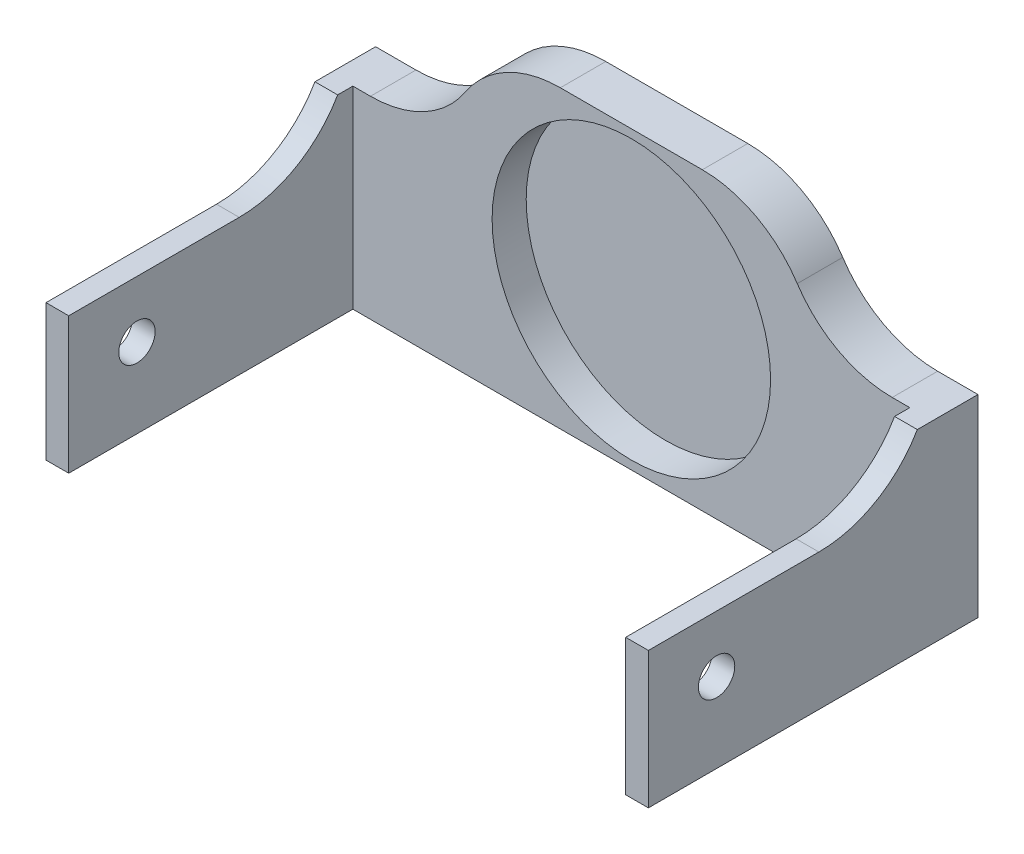
ISO-10303-21;
HEADER;
FILE_DESCRIPTION(('STEP AP214'),'2;1');
FILE_NAME('part.step','',(''),(''),'','','');
FILE_SCHEMA(('AUTOMOTIVE_DESIGN { 1 0 10303 214 1 1 1 1 }'));
ENDSEC;
DATA;
#1=APPLICATION_CONTEXT('core data for automotive mechanical design processes');
#2=APPLICATION_PROTOCOL_DEFINITION('international standard','automotive_design',2000,#1);
#3=PRODUCT_CONTEXT('',#1,'mechanical');
#4=PRODUCT('Part','Part','',(#3));
#5=PRODUCT_RELATED_PRODUCT_CATEGORY('part','',(#4));
#6=PRODUCT_DEFINITION_FORMATION('','',#4);
#7=PRODUCT_DEFINITION_CONTEXT('part definition',#1,'design');
#8=PRODUCT_DEFINITION('design','',#6,#7);
#9=PRODUCT_DEFINITION_SHAPE('','',#8);
#10=(LENGTH_UNIT() NAMED_UNIT(*) SI_UNIT(.MILLI.,.METRE.));
#11=(NAMED_UNIT(*) PLANE_ANGLE_UNIT() SI_UNIT($,.RADIAN.));
#12=(NAMED_UNIT(*) SI_UNIT($,.STERADIAN.) SOLID_ANGLE_UNIT());
#13=UNCERTAINTY_MEASURE_WITH_UNIT(LENGTH_MEASURE(1.E-05),#10,'distance_accuracy_value','');
#14=(GEOMETRIC_REPRESENTATION_CONTEXT(3) GLOBAL_UNCERTAINTY_ASSIGNED_CONTEXT((#13)) GLOBAL_UNIT_ASSIGNED_CONTEXT((#10,
#11,#12)) REPRESENTATION_CONTEXT('',''));
#15=CARTESIAN_POINT('',(0.,0.,0.));
#16=DIRECTION('',(0.,0.,1.));
#17=DIRECTION('',(1.,0.,0.));
#18=AXIS2_PLACEMENT_3D('',#15,#16,#17);
#19=CARTESIAN_POINT('',(0.,0.,4.));
#20=DIRECTION('',(0.,0.,1.));
#21=DIRECTION('',(1.,0.,0.));
#22=AXIS2_PLACEMENT_3D('',#19,#20,#21);
#23=PLANE('',#22);
#24=CARTESIAN_POINT('',(19.6668356823349,-6.75269130805009,4.));
#25=DIRECTION('',(0.,0.,1.));
#26=DIRECTION('',(1.,0.,0.));
#27=AXIS2_PLACEMENT_3D('',#24,#25,#26);
#28=CIRCLE('',#27,12.25);
#29=CARTESIAN_POINT('',(31.9168356823349,-6.75269130805009,4.));
#30=VERTEX_POINT('',#29);
#31=EDGE_CURVE('E252',#30,#30,#28,.T.);
#32=ORIENTED_EDGE('',*,*,#31,.F.);
#33=EDGE_LOOP('',(#32));
#34=FACE_BOUND('',#33,.T.);
#35=DIRECTION('',(0.,-1.,0.));
#36=VECTOR('',#35,1.);
#37=CARTESIAN_POINT('',(44.1668356823349,-7.75269130805008,4.));
#38=LINE('',#37,#36);
#39=CARTESIAN_POINT('',(44.1668356823349,-2.75269130805008,4.));
#40=VERTEX_POINT('',#39);
#41=CARTESIAN_POINT('',(44.1668356823349,-19.7526913080501,4.));
#42=VERTEX_POINT('',#41);
#43=EDGE_CURVE('E206',#40,#42,#38,.T.);
#44=ORIENTED_EDGE('',*,*,#43,.F.);
#45=DIRECTION('',(1.,0.,0.));
#46=VECTOR('',#45,1.);
#47=CARTESIAN_POINT('',(46.1668356823349,-2.75269130805008,4.));
#48=LINE('',#47,#46);
#49=CARTESIAN_POINT('',(42.6167100534011,-2.75269130805008,4.));
#50=VERTEX_POINT('',#49);
#51=EDGE_CURVE('E255',#50,#40,#48,.T.);
#52=ORIENTED_EDGE('',*,*,#51,.F.);
#53=CARTESIAN_POINT('',(42.6167100534011,7.24730869194992,4.));
#54=DIRECTION('',(0.,0.,1.));
#55=DIRECTION('',(1.,0.,0.));
#56=AXIS2_PLACEMENT_3D('',#53,#54,#55);
#57=CIRCLE('',#56,10.);
#58=CARTESIAN_POINT('',(34.2650635091561,1.74730869194992,4.));
#59=VERTEX_POINT('',#58);
#60=EDGE_CURVE('E296',#50,#59,#57,.F.);
#61=ORIENTED_EDGE('',*,*,#60,.T.);
#62=CARTESIAN_POINT('',(25.913416964911,-3.75269130805009,4.));
#63=DIRECTION('',(0.,0.,1.));
#64=DIRECTION('',(1.,0.,0.));
#65=AXIS2_PLACEMENT_3D('',#62,#63,#64);
#66=CIRCLE('',#65,10.);
#67=CARTESIAN_POINT('',(25.913416964911,6.24730869194991,4.));
#68=VERTEX_POINT('',#67);
#69=EDGE_CURVE('E318',#59,#68,#66,.T.);
#70=ORIENTED_EDGE('',*,*,#69,.T.);
#71=DIRECTION('',(-1.,0.,0.));
#72=VECTOR('',#71,1.);
#73=CARTESIAN_POINT('',(-6.83316431766513,6.24730869194991,4.));
#74=LINE('',#73,#72);
#75=CARTESIAN_POINT('',(13.4202543997587,6.24730869194991,4.));
#76=VERTEX_POINT('',#75);
#77=EDGE_CURVE('E189',#68,#76,#74,.T.);
#78=ORIENTED_EDGE('',*,*,#77,.T.);
#79=CARTESIAN_POINT('',(13.4202543997587,-3.75269130805009,4.));
#80=DIRECTION('',(0.,0.,1.));
#81=DIRECTION('',(1.,0.,0.));
#82=AXIS2_PLACEMENT_3D('',#79,#80,#81);
#83=CIRCLE('',#82,10.);
#84=CARTESIAN_POINT('',(5.06860785551371,1.74730869194992,4.));
#85=VERTEX_POINT('',#84);
#86=EDGE_CURVE('E315',#76,#85,#83,.T.);
#87=ORIENTED_EDGE('',*,*,#86,.T.);
#88=CARTESIAN_POINT('',(-3.28303868873133,7.24730869194992,4.));
#89=DIRECTION('',(0.,0.,1.));
#90=DIRECTION('',(1.,0.,0.));
#91=AXIS2_PLACEMENT_3D('',#88,#89,#90);
#92=CIRCLE('',#91,10.);
#93=CARTESIAN_POINT('',(-3.28303868873133,-2.75269130805008,4.));
#94=VERTEX_POINT('',#93);
#95=EDGE_CURVE('E303',#85,#94,#92,.F.);
#96=ORIENTED_EDGE('',*,*,#95,.T.);
#97=DIRECTION('',(1.,0.,0.));
#98=VECTOR('',#97,1.);
#99=CARTESIAN_POINT('',(-6.83316431766512,-2.75269130805008,4.));
#100=LINE('',#99,#98);
#101=CARTESIAN_POINT('',(-4.83316431766513,-2.75269130805008,4.));
#102=VERTEX_POINT('',#101);
#103=EDGE_CURVE('E243',#102,#94,#100,.T.);
#104=ORIENTED_EDGE('',*,*,#103,.F.);
#105=DIRECTION('',(0.,1.,0.));
#106=VECTOR('',#105,1.);
#107=CARTESIAN_POINT('',(-4.83316431766512,-7.75269130805008,4.));
#108=LINE('',#107,#106);
#109=CARTESIAN_POINT('',(-4.83316431766512,-19.7526913080501,4.));
#110=VERTEX_POINT('',#109);
#111=EDGE_CURVE('E212',#110,#102,#108,.T.);
#112=ORIENTED_EDGE('',*,*,#111,.F.);
#113=DIRECTION('',(1.,0.,0.));
#114=VECTOR('',#113,1.);
#115=CARTESIAN_POINT('',(-6.83316431766512,-19.7526913080501,4.));
#116=LINE('',#115,#114);
#117=EDGE_CURVE('E270',#110,#42,#116,.T.);
#118=ORIENTED_EDGE('',*,*,#117,.T.);
#119=EDGE_LOOP('',(#44,#52,#61,#70,#78,#87,#96,#104,#112,#118));
#120=FACE_BOUND('',#119,.T.);
#121=ADVANCED_FACE('F43',(#34,#120),#23,.T.);
#122=CARTESIAN_POINT('',(-6.83316431766513,6.24730869194991,4.));
#123=DIRECTION('',(1.,0.,0.));
#124=DIRECTION('',(0.,1.,0.));
#125=AXIS2_PLACEMENT_3D('',#122,#123,#124);
#126=PLANE('',#125);
#127=CARTESIAN_POINT('',(-6.83316431766512,-12.7526913080501,23.));
#128=DIRECTION('',(-1.,0.,0.));
#129=DIRECTION('',(0.,-1.,0.));
#130=AXIS2_PLACEMENT_3D('',#127,#128,#129);
#131=CIRCLE('',#130,1.6);
#132=CARTESIAN_POINT('',(-6.83316431766512,-14.3526913080501,23.));
#133=VERTEX_POINT('',#132);
#134=EDGE_CURVE('E713',#133,#133,#131,.T.);
#135=ORIENTED_EDGE('',*,*,#134,.F.);
#136=EDGE_LOOP('',(#135));
#137=FACE_BOUND('',#136,.T.);
#138=DIRECTION('',(0.,0.,-1.));
#139=VECTOR('',#138,1.);
#140=CARTESIAN_POINT('',(-6.83316431766512,-7.75269130805008,29.));
#141=LINE('',#140,#139);
#142=CARTESIAN_POINT('',(-6.83316431766512,-7.75269130805008,29.));
#143=VERTEX_POINT('',#142);
#144=CARTESIAN_POINT('',(-6.83316431766512,-7.75269130805008,14.));
#145=VERTEX_POINT('',#144);
#146=EDGE_CURVE('E230',#143,#145,#141,.T.);
#147=ORIENTED_EDGE('',*,*,#146,.T.);
#148=CARTESIAN_POINT('',(-6.83316431766513,2.24730869194992,14.));
#149=DIRECTION('',(1.,0.,0.));
#150=DIRECTION('',(0.,1.,0.));
#151=AXIS2_PLACEMENT_3D('',#148,#149,#150);
#152=CIRCLE('',#151,10.);
#153=CARTESIAN_POINT('',(-6.83316431766512,-2.75269130805008,5.33974596215561));
#154=VERTEX_POINT('',#153);
#155=EDGE_CURVE('E360',#145,#154,#152,.T.);
#156=ORIENTED_EDGE('',*,*,#155,.T.);
#157=DIRECTION('',(0.,0.,1.));
#158=VECTOR('',#157,1.);
#159=CARTESIAN_POINT('',(-6.83316431766512,-2.75269130805008,-0.00100000000000013));
#160=LINE('',#159,#158);
#161=CARTESIAN_POINT('',(-6.83316431766512,-2.75269130805008,0.));
#162=VERTEX_POINT('',#161);
#163=EDGE_CURVE('E64',#162,#154,#160,.T.);
#164=ORIENTED_EDGE('',*,*,#163,.F.);
#165=DIRECTION('',(0.,-1.,0.));
#166=VECTOR('',#165,1.);
#167=CARTESIAN_POINT('',(-6.83316431766513,6.24730869194991,0.));
#168=LINE('',#167,#166);
#169=CARTESIAN_POINT('',(-6.83316431766512,-19.7526913080501,0.));
#170=VERTEX_POINT('',#169);
#171=EDGE_CURVE('E266',#162,#170,#168,.T.);
#172=ORIENTED_EDGE('',*,*,#171,.T.);
#173=DIRECTION('',(0.,0.,-1.));
#174=VECTOR('',#173,1.);
#175=CARTESIAN_POINT('',(-6.83316431766512,-19.7526913080501,4.));
#176=LINE('',#175,#174);
#177=CARTESIAN_POINT('',(-6.83316431766512,-19.7526913080501,29.));
#178=VERTEX_POINT('',#177);
#179=EDGE_CURVE('E188',#178,#170,#176,.T.);
#180=ORIENTED_EDGE('',*,*,#179,.F.);
#181=DIRECTION('',(0.,-1.,0.));
#182=VECTOR('',#181,1.);
#183=CARTESIAN_POINT('',(-6.83316431766512,-7.75269130805008,29.));
#184=LINE('',#183,#182);
#185=EDGE_CURVE('E217',#143,#178,#184,.T.);
#186=ORIENTED_EDGE('',*,*,#185,.F.);
#187=EDGE_LOOP('',(#147,#156,#164,#172,#180,#186));
#188=FACE_BOUND('',#187,.T.);
#189=ADVANCED_FACE('F433',(#137,#188),#126,.F.);
#190=CARTESIAN_POINT('',(-6.83316431766512,-19.7526913080501,4.));
#191=DIRECTION('',(0.,1.,0.));
#192=DIRECTION('',(0.,0.,1.));
#193=AXIS2_PLACEMENT_3D('',#190,#191,#192);
#194=PLANE('',#193);
#195=DIRECTION('',(1.,0.,0.));
#196=VECTOR('',#195,1.);
#197=CARTESIAN_POINT('',(-6.83316431766512,-19.7526913080501,0.));
#198=LINE('',#197,#196);
#199=CARTESIAN_POINT('',(46.1668356823349,-19.7526913080501,0.));
#200=VERTEX_POINT('',#199);
#201=EDGE_CURVE('E184',#170,#200,#198,.T.);
#202=ORIENTED_EDGE('',*,*,#201,.T.);
#203=DIRECTION('',(0.,0.,-1.));
#204=VECTOR('',#203,1.);
#205=CARTESIAN_POINT('',(46.1668356823349,-19.7526913080501,4.));
#206=LINE('',#205,#204);
#207=CARTESIAN_POINT('',(46.1668356823349,-19.7526913080501,29.));
#208=VERTEX_POINT('',#207);
#209=EDGE_CURVE('E177',#208,#200,#206,.T.);
#210=ORIENTED_EDGE('',*,*,#209,.F.);
#211=DIRECTION('',(1.,0.,0.));
#212=VECTOR('',#211,1.);
#213=CARTESIAN_POINT('',(46.1668356823349,-19.7526913080501,29.));
#214=LINE('',#213,#212);
#215=CARTESIAN_POINT('',(44.1668356823349,-19.7526913080501,29.));
#216=VERTEX_POINT('',#215);
#217=EDGE_CURVE('E181',#216,#208,#214,.T.);
#218=ORIENTED_EDGE('',*,*,#217,.F.);
#219=DIRECTION('',(0.,0.,-1.));
#220=VECTOR('',#219,1.);
#221=CARTESIAN_POINT('',(44.1668356823349,-19.7526913080501,29.));
#222=LINE('',#221,#220);
#223=EDGE_CURVE('E200',#216,#42,#222,.T.);
#224=ORIENTED_EDGE('',*,*,#223,.T.);
#225=ORIENTED_EDGE('',*,*,#117,.F.);
#226=DIRECTION('',(0.,0.,-1.));
#227=VECTOR('',#226,1.);
#228=CARTESIAN_POINT('',(-4.83316431766512,-19.7526913080501,29.));
#229=LINE('',#228,#227);
#230=CARTESIAN_POINT('',(-4.83316431766512,-19.7526913080501,29.));
#231=VERTEX_POINT('',#230);
#232=EDGE_CURVE('E239',#231,#110,#229,.T.);
#233=ORIENTED_EDGE('',*,*,#232,.F.);
#234=DIRECTION('',(1.,0.,0.));
#235=VECTOR('',#234,1.);
#236=CARTESIAN_POINT('',(-6.83316431766512,-19.7526913080501,29.));
#237=LINE('',#236,#235);
#238=EDGE_CURVE('E221',#178,#231,#237,.T.);
#239=ORIENTED_EDGE('',*,*,#238,.F.);
#240=ORIENTED_EDGE('',*,*,#179,.T.);
#241=EDGE_LOOP('',(#202,#210,#218,#224,#225,#233,#239,#240));
#242=FACE_BOUND('',#241,.T.);
#243=ADVANCED_FACE('F179',(#242),#194,.F.);
#244=CARTESIAN_POINT('',(46.1668356823349,6.24730869194991,4.));
#245=DIRECTION('',(-1.,0.,0.));
#246=DIRECTION('',(0.,0.,1.));
#247=AXIS2_PLACEMENT_3D('',#244,#245,#246);
#248=PLANE('',#247);
#249=CARTESIAN_POINT('',(46.1668356823349,-12.7526913080501,23.));
#250=DIRECTION('',(-1.,0.,0.));
#251=DIRECTION('',(0.,-1.,0.));
#252=AXIS2_PLACEMENT_3D('',#249,#250,#251);
#253=CIRCLE('',#252,1.6);
#254=CARTESIAN_POINT('',(46.1668356823349,-14.3526913080501,23.));
#255=VERTEX_POINT('',#254);
#256=EDGE_CURVE('E343',#255,#255,#253,.T.);
#257=ORIENTED_EDGE('',*,*,#256,.T.);
#258=EDGE_LOOP('',(#257));
#259=FACE_BOUND('',#258,.T.);
#260=DIRECTION('',(0.,1.,0.));
#261=VECTOR('',#260,1.);
#262=CARTESIAN_POINT('',(46.1668356823349,6.24730869194991,0.));
#263=LINE('',#262,#261);
#264=CARTESIAN_POINT('',(46.1668356823349,-2.75269130805008,0.));
#265=VERTEX_POINT('',#264);
#266=EDGE_CURVE('E281',#200,#265,#263,.T.);
#267=ORIENTED_EDGE('',*,*,#266,.T.);
#268=DIRECTION('',(0.,0.,1.));
#269=VECTOR('',#268,1.);
#270=CARTESIAN_POINT('',(46.1668356823349,-2.75269130805008,-0.00100000000000013));
#271=LINE('',#270,#269);
#272=CARTESIAN_POINT('',(46.1668356823349,-2.75269130805008,5.33974596215561));
#273=VERTEX_POINT('',#272);
#274=EDGE_CURVE('E76',#265,#273,#271,.T.);
#275=ORIENTED_EDGE('',*,*,#274,.T.);
#276=CARTESIAN_POINT('',(46.1668356823349,2.24730869194992,14.));
#277=DIRECTION('',(-1.,0.,0.));
#278=DIRECTION('',(0.,0.,1.));
#279=AXIS2_PLACEMENT_3D('',#276,#277,#278);
#280=CIRCLE('',#279,10.);
#281=CARTESIAN_POINT('',(46.1668356823349,-7.75269130805008,14.));
#282=VERTEX_POINT('',#281);
#283=EDGE_CURVE('E357',#273,#282,#280,.T.);
#284=ORIENTED_EDGE('',*,*,#283,.T.);
#285=DIRECTION('',(0.,0.,-1.));
#286=VECTOR('',#285,1.);
#287=CARTESIAN_POINT('',(46.1668356823349,-7.75269130805008,29.));
#288=LINE('',#287,#286);
#289=CARTESIAN_POINT('',(46.1668356823349,-7.75269130805008,29.));
#290=VERTEX_POINT('',#289);
#291=EDGE_CURVE('E204',#290,#282,#288,.T.);
#292=ORIENTED_EDGE('',*,*,#291,.F.);
#293=DIRECTION('',(0.,1.,0.));
#294=VECTOR('',#293,1.);
#295=CARTESIAN_POINT('',(46.1668356823349,-7.75269130805008,29.));
#296=LINE('',#295,#294);
#297=EDGE_CURVE('E194',#208,#290,#296,.T.);
#298=ORIENTED_EDGE('',*,*,#297,.F.);
#299=ORIENTED_EDGE('',*,*,#209,.T.);
#300=EDGE_LOOP('',(#267,#275,#284,#292,#298,#299));
#301=FACE_BOUND('',#300,.T.);
#302=ADVANCED_FACE('F202',(#259,#301),#248,.F.);
#303=CARTESIAN_POINT('',(-6.83316431766513,6.24730869194991,4.));
#304=DIRECTION('',(0.,-1.,0.));
#305=DIRECTION('',(0.,0.,-1.));
#306=AXIS2_PLACEMENT_3D('',#303,#304,#305);
#307=PLANE('',#306);
#308=ORIENTED_EDGE('',*,*,#77,.F.);
#309=DIRECTION('',(0.,0.,1.));
#310=VECTOR('',#309,1.);
#311=CARTESIAN_POINT('',(25.913416964911,6.24730869194991,4.));
#312=LINE('',#311,#310);
#313=CARTESIAN_POINT('',(25.913416964911,6.24730869194991,0.));
#314=VERTEX_POINT('',#313);
#315=EDGE_CURVE('E325',#68,#314,#312,.F.);
#316=ORIENTED_EDGE('',*,*,#315,.T.);
#317=DIRECTION('',(-1.,0.,0.));
#318=VECTOR('',#317,1.);
#319=CARTESIAN_POINT('',(-6.83316431766513,6.24730869194991,0.));
#320=LINE('',#319,#318);
#321=CARTESIAN_POINT('',(13.4202543997587,6.24730869194991,0.));
#322=VERTEX_POINT('',#321);
#323=EDGE_CURVE('E273',#314,#322,#320,.T.);
#324=ORIENTED_EDGE('',*,*,#323,.T.);
#325=DIRECTION('',(0.,0.,-1.));
#326=VECTOR('',#325,1.);
#327=CARTESIAN_POINT('',(13.4202543997587,6.24730869194991,4.));
#328=LINE('',#327,#326);
#329=EDGE_CURVE('E321',#322,#76,#328,.F.);
#330=ORIENTED_EDGE('',*,*,#329,.T.);
#331=EDGE_LOOP('',(#308,#316,#324,#330));
#332=FACE_BOUND('',#331,.T.);
#333=ADVANCED_FACE('F419',(#332),#307,.F.);
#334=CARTESIAN_POINT('',(0.,0.,0.));
#335=DIRECTION('',(0.,0.,1.));
#336=DIRECTION('',(1.,0.,0.));
#337=AXIS2_PLACEMENT_3D('',#334,#335,#336);
#338=PLANE('',#337);
#339=ORIENTED_EDGE('',*,*,#323,.F.);
#340=CARTESIAN_POINT('',(25.913416964911,-3.75269130805009,0.));
#341=DIRECTION('',(0.,0.,1.));
#342=DIRECTION('',(1.,0.,0.));
#343=AXIS2_PLACEMENT_3D('',#340,#341,#342);
#344=CIRCLE('',#343,10.);
#345=CARTESIAN_POINT('',(34.2650635091561,1.74730869194992,0.));
#346=VERTEX_POINT('',#345);
#347=EDGE_CURVE('E331',#314,#346,#344,.F.);
#348=ORIENTED_EDGE('',*,*,#347,.T.);
#349=CARTESIAN_POINT('',(42.6167100534011,7.24730869194992,0.));
#350=DIRECTION('',(0.,0.,1.));
#351=DIRECTION('',(1.,0.,0.));
#352=AXIS2_PLACEMENT_3D('',#349,#350,#351);
#353=CIRCLE('',#352,10.);
#354=CARTESIAN_POINT('',(42.6167100534011,-2.75269130805008,0.));
#355=VERTEX_POINT('',#354);
#356=EDGE_CURVE('E300',#346,#355,#353,.T.);
#357=ORIENTED_EDGE('',*,*,#356,.T.);
#358=DIRECTION('',(-1.,0.,0.));
#359=VECTOR('',#358,1.);
#360=CARTESIAN_POINT('',(46.1668356823349,-2.75269130805008,0.));
#361=LINE('',#360,#359);
#362=EDGE_CURVE('E246',#265,#355,#361,.T.);
#363=ORIENTED_EDGE('',*,*,#362,.F.);
#364=ORIENTED_EDGE('',*,*,#266,.F.);
#365=ORIENTED_EDGE('',*,*,#201,.F.);
#366=ORIENTED_EDGE('',*,*,#171,.F.);
#367=DIRECTION('',(-1.,0.,0.));
#368=VECTOR('',#367,1.);
#369=CARTESIAN_POINT('',(-6.83316431766512,-2.75269130805008,0.));
#370=LINE('',#369,#368);
#371=CARTESIAN_POINT('',(-3.28303868873133,-2.75269130805008,0.));
#372=VERTEX_POINT('',#371);
#373=EDGE_CURVE('E249',#372,#162,#370,.T.);
#374=ORIENTED_EDGE('',*,*,#373,.F.);
#375=CARTESIAN_POINT('',(-3.28303868873133,7.24730869194992,0.));
#376=DIRECTION('',(0.,0.,1.));
#377=DIRECTION('',(1.,0.,0.));
#378=AXIS2_PLACEMENT_3D('',#375,#376,#377);
#379=CIRCLE('',#378,10.);
#380=CARTESIAN_POINT('',(5.06860785551371,1.74730869194992,0.));
#381=VERTEX_POINT('',#380);
#382=EDGE_CURVE('E307',#372,#381,#379,.T.);
#383=ORIENTED_EDGE('',*,*,#382,.T.);
#384=CARTESIAN_POINT('',(13.4202543997587,-3.75269130805009,0.));
#385=DIRECTION('',(0.,0.,1.));
#386=DIRECTION('',(1.,0.,0.));
#387=AXIS2_PLACEMENT_3D('',#384,#385,#386);
#388=CIRCLE('',#387,10.);
#389=EDGE_CURVE('E328',#381,#322,#388,.F.);
#390=ORIENTED_EDGE('',*,*,#389,.T.);
#391=EDGE_LOOP('',(#339,#348,#357,#363,#364,#365,#366,#374,#383,#390));
#392=FACE_BOUND('',#391,.T.);
#393=ADVANCED_FACE('F412',(#392),#338,.F.);
#394=CARTESIAN_POINT('',(19.6668356823349,-6.75269130805009,1.));
#395=DIRECTION('',(0.,0.,1.));
#396=DIRECTION('',(1.,0.,0.));
#397=AXIS2_PLACEMENT_3D('',#394,#395,#396);
#398=CYLINDRICAL_SURFACE('',#397,12.25);
#399=CARTESIAN_POINT('',(19.6668356823349,-6.75269130805009,1.));
#400=DIRECTION('',(0.,0.,1.));
#401=DIRECTION('',(1.,0.,0.));
#402=AXIS2_PLACEMENT_3D('',#399,#400,#401);
#403=CIRCLE('',#402,12.25);
#404=CARTESIAN_POINT('',(31.9168356823349,-6.75269130805009,1.));
#405=VERTEX_POINT('',#404);
#406=EDGE_CURVE('E262',#405,#405,#403,.T.);
#407=ORIENTED_EDGE('',*,*,#406,.F.);
#408=EDGE_LOOP('',(#407));
#409=FACE_BOUND('',#408,.T.);
#410=ORIENTED_EDGE('',*,*,#31,.T.);
#411=EDGE_LOOP('',(#410));
#412=FACE_BOUND('',#411,.T.);
#413=ADVANCED_FACE('F462',(#409,#412),#398,.F.);
#414=CARTESIAN_POINT('',(19.6668356823349,-6.75269130805009,1.));
#415=DIRECTION('',(0.,0.,1.));
#416=DIRECTION('',(1.,0.,0.));
#417=AXIS2_PLACEMENT_3D('',#414,#415,#416);
#418=PLANE('',#417);
#419=ORIENTED_EDGE('',*,*,#406,.T.);
#420=EDGE_LOOP('',(#419));
#421=FACE_BOUND('',#420,.T.);
#422=ADVANCED_FACE('F546',(#421),#418,.T.);
#423=CARTESIAN_POINT('',(46.1668356823349,-2.75269130805008,-0.00100000000000013));
#424=DIRECTION('',(0.,-1.,0.));
#425=DIRECTION('',(1.,0.,0.));
#426=AXIS2_PLACEMENT_3D('',#423,#424,#425);
#427=PLANE('',#426);
#428=ORIENTED_EDGE('',*,*,#362,.T.);
#429=DIRECTION('',(0.,0.,1.));
#430=VECTOR('',#429,1.);
#431=CARTESIAN_POINT('',(42.6167100534011,-2.75269130805008,-0.00100000000000013));
#432=LINE('',#431,#430);
#433=EDGE_CURVE('E289',#355,#50,#432,.T.);
#434=ORIENTED_EDGE('',*,*,#433,.T.);
#435=ORIENTED_EDGE('',*,*,#51,.T.);
#436=DIRECTION('',(0.,0.,1.));
#437=VECTOR('',#436,1.);
#438=CARTESIAN_POINT('',(44.1668356823349,-2.75269130805008,-0.00100000000000013));
#439=LINE('',#438,#437);
#440=CARTESIAN_POINT('',(44.1668356823349,-2.75269130805008,5.33974596215561));
#441=VERTEX_POINT('',#440);
#442=EDGE_CURVE('E52',#40,#441,#439,.T.);
#443=ORIENTED_EDGE('',*,*,#442,.T.);
#444=DIRECTION('',(-1.,0.,0.));
#445=VECTOR('',#444,1.);
#446=CARTESIAN_POINT('',(44.1668356823349,-2.75269130805008,5.33974596215561));
#447=LINE('',#446,#445);
#448=EDGE_CURVE('E354',#441,#273,#447,.F.);
#449=ORIENTED_EDGE('',*,*,#448,.T.);
#450=ORIENTED_EDGE('',*,*,#274,.F.);
#451=EDGE_LOOP('',(#428,#434,#435,#443,#449,#450));
#452=FACE_BOUND('',#451,.T.);
#453=ADVANCED_FACE('F371',(#452),#427,.F.);
#454=CARTESIAN_POINT('',(-6.83316431766512,-2.75269130805008,-0.00100000000000013));
#455=DIRECTION('',(0.,-1.,0.));
#456=DIRECTION('',(0.,0.,-1.));
#457=AXIS2_PLACEMENT_3D('',#454,#455,#456);
#458=PLANE('',#457);
#459=ORIENTED_EDGE('',*,*,#163,.T.);
#460=DIRECTION('',(-1.,0.,0.));
#461=VECTOR('',#460,1.);
#462=CARTESIAN_POINT('',(-6.83316431766512,-2.75269130805008,5.33974596215561));
#463=LINE('',#462,#461);
#464=CARTESIAN_POINT('',(-4.83316431766513,-2.75269130805008,5.33974596215561));
#465=VERTEX_POINT('',#464);
#466=EDGE_CURVE('E59',#154,#465,#463,.F.);
#467=ORIENTED_EDGE('',*,*,#466,.T.);
#468=DIRECTION('',(0.,0.,-1.));
#469=VECTOR('',#468,1.);
#470=CARTESIAN_POINT('',(-4.83316431766512,-2.75269130805008,-0.00100000000000013));
#471=LINE('',#470,#469);
#472=EDGE_CURVE('E11',#102,#465,#471,.F.);
#473=ORIENTED_EDGE('',*,*,#472,.F.);
#474=ORIENTED_EDGE('',*,*,#103,.T.);
#475=DIRECTION('',(0.,0.,-1.));
#476=VECTOR('',#475,1.);
#477=CARTESIAN_POINT('',(-3.28303868873133,-2.75269130805008,-0.00100000000000013));
#478=LINE('',#477,#476);
#479=EDGE_CURVE('E293',#94,#372,#478,.T.);
#480=ORIENTED_EDGE('',*,*,#479,.T.);
#481=ORIENTED_EDGE('',*,*,#373,.T.);
#482=EDGE_LOOP('',(#459,#467,#473,#474,#480,#481));
#483=FACE_BOUND('',#482,.T.);
#484=ADVANCED_FACE('F401',(#483),#458,.F.);
#485=CARTESIAN_POINT('',(42.6167100534011,7.24730869194992,-0.00100000000000013));
#486=DIRECTION('',(0.,0.,1.));
#487=DIRECTION('',(1.,0.,0.));
#488=AXIS2_PLACEMENT_3D('',#485,#486,#487);
#489=CYLINDRICAL_SURFACE('',#488,10.);
#490=ORIENTED_EDGE('',*,*,#356,.F.);
#491=DIRECTION('',(0.,0.,1.));
#492=VECTOR('',#491,1.);
#493=CARTESIAN_POINT('',(34.2650635091561,1.74730869194992,-0.00100000000000013));
#494=LINE('',#493,#492);
#495=EDGE_CURVE('E311',#346,#59,#494,.T.);
#496=ORIENTED_EDGE('',*,*,#495,.T.);
#497=ORIENTED_EDGE('',*,*,#60,.F.);
#498=ORIENTED_EDGE('',*,*,#433,.F.);
#499=EDGE_LOOP('',(#490,#496,#497,#498));
#500=FACE_BOUND('',#499,.T.);
#501=ADVANCED_FACE('F427',(#500),#489,.F.);
#502=CARTESIAN_POINT('',(-3.28303868873133,7.24730869194992,-0.00100000000000013));
#503=DIRECTION('',(0.,0.,-1.));
#504=DIRECTION('',(-1.,0.,0.));
#505=AXIS2_PLACEMENT_3D('',#502,#503,#504);
#506=CYLINDRICAL_SURFACE('',#505,10.);
#507=ORIENTED_EDGE('',*,*,#95,.F.);
#508=DIRECTION('',(0.,0.,-1.));
#509=VECTOR('',#508,1.);
#510=CARTESIAN_POINT('',(5.06860785551371,1.74730869194992,-0.00100000000000013));
#511=LINE('',#510,#509);
#512=EDGE_CURVE('E334',#85,#381,#511,.T.);
#513=ORIENTED_EDGE('',*,*,#512,.T.);
#514=ORIENTED_EDGE('',*,*,#382,.F.);
#515=ORIENTED_EDGE('',*,*,#479,.F.);
#516=EDGE_LOOP('',(#507,#513,#514,#515));
#517=FACE_BOUND('',#516,.T.);
#518=ADVANCED_FACE('F408',(#517),#506,.F.);
#519=CARTESIAN_POINT('',(25.913416964911,-3.75269130805009,-0.00100000000000013));
#520=DIRECTION('',(0.,0.,1.));
#521=DIRECTION('',(1.,0.,0.));
#522=AXIS2_PLACEMENT_3D('',#519,#520,#521);
#523=CYLINDRICAL_SURFACE('',#522,10.);
#524=ORIENTED_EDGE('',*,*,#347,.F.);
#525=ORIENTED_EDGE('',*,*,#315,.F.);
#526=ORIENTED_EDGE('',*,*,#69,.F.);
#527=ORIENTED_EDGE('',*,*,#495,.F.);
#528=EDGE_LOOP('',(#524,#525,#526,#527));
#529=FACE_BOUND('',#528,.T.);
#530=ADVANCED_FACE('F424',(#529),#523,.T.);
#531=CARTESIAN_POINT('',(13.4202543997587,-3.75269130805009,-0.00100000000000013));
#532=DIRECTION('',(0.,0.,-1.));
#533=DIRECTION('',(-1.,0.,0.));
#534=AXIS2_PLACEMENT_3D('',#531,#532,#533);
#535=CYLINDRICAL_SURFACE('',#534,10.);
#536=ORIENTED_EDGE('',*,*,#389,.F.);
#537=ORIENTED_EDGE('',*,*,#512,.F.);
#538=ORIENTED_EDGE('',*,*,#86,.F.);
#539=ORIENTED_EDGE('',*,*,#329,.F.);
#540=EDGE_LOOP('',(#536,#537,#538,#539));
#541=FACE_BOUND('',#540,.T.);
#542=ADVANCED_FACE('F416',(#541),#535,.T.);
#543=CARTESIAN_POINT('',(-4.83316431766512,-7.75269130805008,29.));
#544=DIRECTION('',(-1.,0.,0.));
#545=DIRECTION('',(0.,-1.,0.));
#546=AXIS2_PLACEMENT_3D('',#543,#544,#545);
#547=PLANE('',#546);
#548=CARTESIAN_POINT('',(-4.83316431766512,-12.7526913080501,23.));
#549=DIRECTION('',(-1.,0.,0.));
#550=DIRECTION('',(0.,-1.,0.));
#551=AXIS2_PLACEMENT_3D('',#548,#549,#550);
#552=CIRCLE('',#551,1.6);
#553=CARTESIAN_POINT('',(-4.83316431766512,-14.3526913080501,23.));
#554=VERTEX_POINT('',#553);
#555=EDGE_CURVE('E342',#554,#554,#552,.T.);
#556=ORIENTED_EDGE('',*,*,#555,.T.);
#557=EDGE_LOOP('',(#556));
#558=FACE_BOUND('',#557,.T.);
#559=ORIENTED_EDGE('',*,*,#111,.T.);
#560=ORIENTED_EDGE('',*,*,#472,.T.);
#561=CARTESIAN_POINT('',(-4.83316431766513,2.24730869194992,14.));
#562=DIRECTION('',(-1.,0.,0.));
#563=DIRECTION('',(0.,-1.,0.));
#564=AXIS2_PLACEMENT_3D('',#561,#562,#563);
#565=CIRCLE('',#564,10.);
#566=CARTESIAN_POINT('',(-4.83316431766512,-7.75269130805008,14.));
#567=VERTEX_POINT('',#566);
#568=EDGE_CURVE('E84',#465,#567,#565,.T.);
#569=ORIENTED_EDGE('',*,*,#568,.T.);
#570=DIRECTION('',(0.,0.,-1.));
#571=VECTOR('',#570,1.);
#572=CARTESIAN_POINT('',(-4.83316431766512,-7.75269130805008,29.));
#573=LINE('',#572,#571);
#574=CARTESIAN_POINT('',(-4.83316431766512,-7.75269130805008,29.));
#575=VERTEX_POINT('',#574);
#576=EDGE_CURVE('E236',#575,#567,#573,.T.);
#577=ORIENTED_EDGE('',*,*,#576,.F.);
#578=DIRECTION('',(0.,1.,0.));
#579=VECTOR('',#578,1.);
#580=CARTESIAN_POINT('',(-4.83316431766512,-7.75269130805008,29.));
#581=LINE('',#580,#579);
#582=EDGE_CURVE('E224',#231,#575,#581,.T.);
#583=ORIENTED_EDGE('',*,*,#582,.F.);
#584=ORIENTED_EDGE('',*,*,#232,.T.);
#585=EDGE_LOOP('',(#559,#560,#569,#577,#583,#584));
#586=FACE_BOUND('',#585,.T.);
#587=ADVANCED_FACE('F399',(#558,#586),#547,.F.);
#588=CARTESIAN_POINT('',(-6.83316431766512,-7.75269130805008,29.));
#589=DIRECTION('',(0.,-1.,0.));
#590=DIRECTION('',(0.,0.,-1.));
#591=AXIS2_PLACEMENT_3D('',#588,#589,#590);
#592=PLANE('',#591);
#593=ORIENTED_EDGE('',*,*,#576,.T.);
#594=DIRECTION('',(-1.,0.,0.));
#595=VECTOR('',#594,1.);
#596=CARTESIAN_POINT('',(-6.83316431766512,-7.75269130805008,14.));
#597=LINE('',#596,#595);
#598=EDGE_CURVE('E347',#567,#145,#597,.T.);
#599=ORIENTED_EDGE('',*,*,#598,.T.);
#600=ORIENTED_EDGE('',*,*,#146,.F.);
#601=DIRECTION('',(-1.,0.,0.));
#602=VECTOR('',#601,1.);
#603=CARTESIAN_POINT('',(-6.83316431766512,-7.75269130805008,29.));
#604=LINE('',#603,#602);
#605=EDGE_CURVE('E227',#575,#143,#604,.T.);
#606=ORIENTED_EDGE('',*,*,#605,.F.);
#607=EDGE_LOOP('',(#593,#599,#600,#606));
#608=FACE_BOUND('',#607,.T.);
#609=ADVANCED_FACE('F438',(#608),#592,.F.);
#610=CARTESIAN_POINT('',(0.,0.,29.));
#611=DIRECTION('',(0.,0.,1.));
#612=DIRECTION('',(1.,0.,0.));
#613=AXIS2_PLACEMENT_3D('',#610,#611,#612);
#614=PLANE('',#613);
#615=ORIENTED_EDGE('',*,*,#185,.T.);
#616=ORIENTED_EDGE('',*,*,#238,.T.);
#617=ORIENTED_EDGE('',*,*,#582,.T.);
#618=ORIENTED_EDGE('',*,*,#605,.T.);
#619=EDGE_LOOP('',(#615,#616,#617,#618));
#620=FACE_BOUND('',#619,.T.);
#621=ADVANCED_FACE('F441',(#620),#614,.T.);
#622=CARTESIAN_POINT('',(46.1668356823349,-7.75269130805008,29.));
#623=DIRECTION('',(0.,-1.,0.));
#624=DIRECTION('',(1.,0.,0.));
#625=AXIS2_PLACEMENT_3D('',#622,#623,#624);
#626=PLANE('',#625);
#627=ORIENTED_EDGE('',*,*,#291,.T.);
#628=DIRECTION('',(-1.,0.,0.));
#629=VECTOR('',#628,1.);
#630=CARTESIAN_POINT('',(46.1668356823349,-7.75269130805008,14.));
#631=LINE('',#630,#629);
#632=CARTESIAN_POINT('',(44.1668356823349,-7.75269130805008,14.));
#633=VERTEX_POINT('',#632);
#634=EDGE_CURVE('E337',#282,#633,#631,.T.);
#635=ORIENTED_EDGE('',*,*,#634,.T.);
#636=DIRECTION('',(0.,0.,-1.));
#637=VECTOR('',#636,1.);
#638=CARTESIAN_POINT('',(44.1668356823349,-7.75269130805008,29.));
#639=LINE('',#638,#637);
#640=CARTESIAN_POINT('',(44.1668356823349,-7.75269130805008,29.));
#641=VERTEX_POINT('',#640);
#642=EDGE_CURVE('E383',#641,#633,#639,.T.);
#643=ORIENTED_EDGE('',*,*,#642,.F.);
#644=DIRECTION('',(-1.,0.,0.));
#645=VECTOR('',#644,1.);
#646=CARTESIAN_POINT('',(46.1668356823349,-7.75269130805008,29.));
#647=LINE('',#646,#645);
#648=EDGE_CURVE('E207',#290,#641,#647,.T.);
#649=ORIENTED_EDGE('',*,*,#648,.F.);
#650=EDGE_LOOP('',(#627,#635,#643,#649));
#651=FACE_BOUND('',#650,.T.);
#652=ADVANCED_FACE('F379',(#651),#626,.F.);
#653=CARTESIAN_POINT('',(44.1668356823349,-7.75269130805008,29.));
#654=DIRECTION('',(1.,0.,0.));
#655=DIRECTION('',(0.,1.,0.));
#656=AXIS2_PLACEMENT_3D('',#653,#654,#655);
#657=PLANE('',#656);
#658=CARTESIAN_POINT('',(44.1668356823349,-12.7526913080501,23.));
#659=DIRECTION('',(1.,0.,0.));
#660=DIRECTION('',(0.,1.,0.));
#661=AXIS2_PLACEMENT_3D('',#658,#659,#660);
#662=CIRCLE('',#661,1.6);
#663=CARTESIAN_POINT('',(44.1668356823349,-14.3526913080501,23.));
#664=VERTEX_POINT('',#663);
#665=EDGE_CURVE('E338',#664,#664,#662,.T.);
#666=ORIENTED_EDGE('',*,*,#665,.T.);
#667=EDGE_LOOP('',(#666));
#668=FACE_BOUND('',#667,.T.);
#669=ORIENTED_EDGE('',*,*,#43,.T.);
#670=ORIENTED_EDGE('',*,*,#223,.F.);
#671=DIRECTION('',(0.,-1.,0.));
#672=VECTOR('',#671,1.);
#673=CARTESIAN_POINT('',(44.1668356823349,-7.75269130805008,29.));
#674=LINE('',#673,#672);
#675=EDGE_CURVE('E197',#641,#216,#674,.T.);
#676=ORIENTED_EDGE('',*,*,#675,.F.);
#677=ORIENTED_EDGE('',*,*,#642,.T.);
#678=CARTESIAN_POINT('',(44.1668356823349,2.24730869194992,14.));
#679=DIRECTION('',(1.,0.,0.));
#680=DIRECTION('',(0.,1.,0.));
#681=AXIS2_PLACEMENT_3D('',#678,#679,#680);
#682=CIRCLE('',#681,10.);
#683=EDGE_CURVE('E351',#633,#441,#682,.T.);
#684=ORIENTED_EDGE('',*,*,#683,.T.);
#685=ORIENTED_EDGE('',*,*,#442,.F.);
#686=EDGE_LOOP('',(#669,#670,#676,#677,#684,#685));
#687=FACE_BOUND('',#686,.T.);
#688=ADVANCED_FACE('F396',(#668,#687),#657,.F.);
#689=CARTESIAN_POINT('',(0.,0.,29.));
#690=DIRECTION('',(0.,0.,-1.));
#691=DIRECTION('',(-1.,0.,0.));
#692=AXIS2_PLACEMENT_3D('',#689,#690,#691);
#693=PLANE('',#692);
#694=ORIENTED_EDGE('',*,*,#297,.T.);
#695=ORIENTED_EDGE('',*,*,#648,.T.);
#696=ORIENTED_EDGE('',*,*,#675,.T.);
#697=ORIENTED_EDGE('',*,*,#217,.T.);
#698=EDGE_LOOP('',(#694,#695,#696,#697));
#699=FACE_BOUND('',#698,.T.);
#700=ADVANCED_FACE('F193',(#699),#693,.F.);
#701=CARTESIAN_POINT('',(46.1668356823349,-12.7526913080501,23.));
#702=DIRECTION('',(-1.,0.,0.));
#703=DIRECTION('',(0.,-1.,0.));
#704=AXIS2_PLACEMENT_3D('',#701,#702,#703);
#705=CYLINDRICAL_SURFACE('',#704,1.6);
#706=CARTESIAN_POINT('',(46.1668356823349,-14.3526913080501,23.));
#707=CARTESIAN_POINT('',(46.1460023490016,-14.3526913080501,23.));
#708=CARTESIAN_POINT('',(46.1251690156682,-14.3526913080501,23.));
#709=CARTESIAN_POINT('',(46.0835023490016,-14.3526913080501,23.));
#710=CARTESIAN_POINT('',(46.0626690156682,-14.3526913080501,23.));
#711=CARTESIAN_POINT('',(46.0210023490016,-14.3526913080501,23.));
#712=CARTESIAN_POINT('',(46.0001690156682,-14.3526913080501,23.));
#713=CARTESIAN_POINT('',(45.9585023490016,-14.3526913080501,23.));
#714=CARTESIAN_POINT('',(45.9376690156682,-14.3526913080501,23.));
#715=CARTESIAN_POINT('',(45.8960023490016,-14.3526913080501,23.));
#716=CARTESIAN_POINT('',(45.8751690156682,-14.3526913080501,23.));
#717=CARTESIAN_POINT('',(45.8335023490016,-14.3526913080501,23.));
#718=CARTESIAN_POINT('',(45.8126690156682,-14.3526913080501,23.));
#719=CARTESIAN_POINT('',(45.7710023490016,-14.3526913080501,23.));
#720=CARTESIAN_POINT('',(45.7501690156682,-14.3526913080501,23.));
#721=CARTESIAN_POINT('',(45.7085023490016,-14.3526913080501,23.));
#722=CARTESIAN_POINT('',(45.6876690156682,-14.3526913080501,23.));
#723=CARTESIAN_POINT('',(45.6460023490016,-14.3526913080501,23.));
#724=CARTESIAN_POINT('',(45.6251690156682,-14.3526913080501,23.));
#725=CARTESIAN_POINT('',(45.5835023490016,-14.3526913080501,23.));
#726=CARTESIAN_POINT('',(45.5626690156682,-14.3526913080501,23.));
#727=CARTESIAN_POINT('',(45.5210023490016,-14.3526913080501,23.));
#728=CARTESIAN_POINT('',(45.5001690156682,-14.3526913080501,23.));
#729=CARTESIAN_POINT('',(45.4585023490016,-14.3526913080501,23.));
#730=CARTESIAN_POINT('',(45.4376690156682,-14.3526913080501,23.));
#731=CARTESIAN_POINT('',(45.3960023490016,-14.3526913080501,23.));
#732=CARTESIAN_POINT('',(45.3751690156682,-14.3526913080501,23.));
#733=CARTESIAN_POINT('',(45.3335023490016,-14.3526913080501,23.));
#734=CARTESIAN_POINT('',(45.3126690156682,-14.3526913080501,23.));
#735=CARTESIAN_POINT('',(45.2710023490016,-14.3526913080501,23.));
#736=CARTESIAN_POINT('',(45.2501690156682,-14.3526913080501,23.));
#737=CARTESIAN_POINT('',(45.2085023490016,-14.3526913080501,23.));
#738=CARTESIAN_POINT('',(45.1876690156682,-14.3526913080501,23.));
#739=CARTESIAN_POINT('',(45.1460023490016,-14.3526913080501,23.));
#740=CARTESIAN_POINT('',(45.1251690156682,-14.3526913080501,23.));
#741=CARTESIAN_POINT('',(45.0835023490016,-14.3526913080501,23.));
#742=CARTESIAN_POINT('',(45.0626690156682,-14.3526913080501,23.));
#743=CARTESIAN_POINT('',(45.0210023490016,-14.3526913080501,23.));
#744=CARTESIAN_POINT('',(45.0001690156682,-14.3526913080501,23.));
#745=CARTESIAN_POINT('',(44.9585023490016,-14.3526913080501,23.));
#746=CARTESIAN_POINT('',(44.9376690156682,-14.3526913080501,23.));
#747=CARTESIAN_POINT('',(44.8960023490016,-14.3526913080501,23.));
#748=CARTESIAN_POINT('',(44.8751690156682,-14.3526913080501,23.));
#749=CARTESIAN_POINT('',(44.8335023490016,-14.3526913080501,23.));
#750=CARTESIAN_POINT('',(44.8126690156682,-14.3526913080501,23.));
#751=CARTESIAN_POINT('',(44.7710023490016,-14.3526913080501,23.));
#752=CARTESIAN_POINT('',(44.7501690156682,-14.3526913080501,23.));
#753=CARTESIAN_POINT('',(44.7085023490016,-14.3526913080501,23.));
#754=CARTESIAN_POINT('',(44.6876690156682,-14.3526913080501,23.));
#755=CARTESIAN_POINT('',(44.6460023490016,-14.3526913080501,23.));
#756=CARTESIAN_POINT('',(44.6251690156682,-14.3526913080501,23.));
#757=CARTESIAN_POINT('',(44.5835023490016,-14.3526913080501,23.));
#758=CARTESIAN_POINT('',(44.5626690156682,-14.3526913080501,23.));
#759=CARTESIAN_POINT('',(44.5210023490016,-14.3526913080501,23.));
#760=CARTESIAN_POINT('',(44.5001690156682,-14.3526913080501,23.));
#761=CARTESIAN_POINT('',(44.4585023490016,-14.3526913080501,23.));
#762=CARTESIAN_POINT('',(44.4376690156682,-14.3526913080501,23.));
#763=CARTESIAN_POINT('',(44.3960023490016,-14.3526913080501,23.));
#764=CARTESIAN_POINT('',(44.3751690156682,-14.3526913080501,23.));
#765=CARTESIAN_POINT('',(44.3335023490016,-14.3526913080501,23.));
#766=CARTESIAN_POINT('',(44.3126690156682,-14.3526913080501,23.));
#767=CARTESIAN_POINT('',(44.2710023490015,-14.3526913080501,23.));
#768=CARTESIAN_POINT('',(44.2501690156682,-14.3526913080501,23.));
#769=CARTESIAN_POINT('',(44.2085023490015,-14.3526913080501,23.));
#770=CARTESIAN_POINT('',(44.1876690156682,-14.3526913080501,23.));
#771=CARTESIAN_POINT('',(44.1668356823349,-14.3526913080501,23.));
#772=B_SPLINE_CURVE_WITH_KNOTS('',3,(#706,#707,#708,#709,#710,#711,#712,#713,#714,#715,#716,
#717,#718,#719,#720,#721,#722,#723,#724,#725,#726,#727,#728,#729,#730,#731,#732,#733,#734,#735,
#736,#737,#738,#739,#740,#741,#742,#743,#744,#745,#746,#747,#748,#749,#750,#751,#752,#753,#754,
#755,#756,#757,#758,#759,#760,#761,#762,#763,#764,#765,#766,#767,#768,#769,#770,#771),
.UNSPECIFIED.,.F.,.F.,(4,2,2,2,2,2,2,2,2,2,2,2,2,2,2,2,2,2,2,2,2,2,2,2,2,2,2,2,2,2,2,2,4),(0.,
0.062500000000007,0.125000000000007,0.187500000000007,0.250000000000007,0.312500000000007,
0.375000000000007,0.437500000000007,0.500000000000007,0.562500000000007,0.625000000000008,
0.687500000000008,0.750000000000008,0.812500000000008,0.875000000000008,0.937500000000008,
1.00000000000001,1.06250000000001,1.12500000000001,1.18750000000001,1.25000000000002,
1.31250000000002,1.37500000000002,1.43750000000002,1.50000000000002,1.56250000000002,
1.62500000000002,1.68750000000002,1.75000000000002,1.81250000000002,1.87500000000002,
1.93750000000002,2.00000000000002),.UNSPECIFIED.);
#773=EDGE_CURVE('BSEAM486',#255,#664,#772,.T.);
#774=ORIENTED_EDGE('',*,*,#256,.F.);
#775=ORIENTED_EDGE('',*,*,#665,.F.);
#776=ORIENTED_EDGE('',*,*,#773,.T.);
#777=ORIENTED_EDGE('',*,*,#773,.F.);
#778=EDGE_LOOP('',(#774,#776,#775,#777));
#779=FACE_BOUND('',#778,.T.);
#780=ADVANCED_FACE('F486',(#779),#705,.F.);
#781=CARTESIAN_POINT('',(-6.83316431766512,-14.3526913080501,23.));
#782=CARTESIAN_POINT('',(-6.81233098433179,-14.3526913080501,23.));
#783=CARTESIAN_POINT('',(-6.79149765099845,-14.3526913080501,23.));
#784=CARTESIAN_POINT('',(-6.74983098433179,-14.3526913080501,23.));
#785=CARTESIAN_POINT('',(-6.72899765099845,-14.3526913080501,23.));
#786=CARTESIAN_POINT('',(-6.68733098433179,-14.3526913080501,23.));
#787=CARTESIAN_POINT('',(-6.66649765099845,-14.3526913080501,23.));
#788=CARTESIAN_POINT('',(-6.62483098433179,-14.3526913080501,23.));
#789=CARTESIAN_POINT('',(-6.60399765099845,-14.3526913080501,23.));
#790=CARTESIAN_POINT('',(-6.56233098433179,-14.3526913080501,23.));
#791=CARTESIAN_POINT('',(-6.54149765099845,-14.3526913080501,23.));
#792=CARTESIAN_POINT('',(-6.49983098433179,-14.3526913080501,23.));
#793=CARTESIAN_POINT('',(-6.47899765099845,-14.3526913080501,23.));
#794=CARTESIAN_POINT('',(-6.43733098433179,-14.3526913080501,23.));
#795=CARTESIAN_POINT('',(-6.41649765099845,-14.3526913080501,23.));
#796=CARTESIAN_POINT('',(-6.37483098433179,-14.3526913080501,23.));
#797=CARTESIAN_POINT('',(-6.35399765099845,-14.3526913080501,23.));
#798=CARTESIAN_POINT('',(-6.31233098433179,-14.3526913080501,23.));
#799=CARTESIAN_POINT('',(-6.29149765099845,-14.3526913080501,23.));
#800=CARTESIAN_POINT('',(-6.24983098433179,-14.3526913080501,23.));
#801=CARTESIAN_POINT('',(-6.22899765099845,-14.3526913080501,23.));
#802=CARTESIAN_POINT('',(-6.18733098433179,-14.3526913080501,23.));
#803=CARTESIAN_POINT('',(-6.16649765099845,-14.3526913080501,23.));
#804=CARTESIAN_POINT('',(-6.12483098433179,-14.3526913080501,23.));
#805=CARTESIAN_POINT('',(-6.10399765099845,-14.3526913080501,23.));
#806=CARTESIAN_POINT('',(-6.06233098433179,-14.3526913080501,23.));
#807=CARTESIAN_POINT('',(-6.04149765099845,-14.3526913080501,23.));
#808=CARTESIAN_POINT('',(-5.99983098433179,-14.3526913080501,23.));
#809=CARTESIAN_POINT('',(-5.97899765099845,-14.3526913080501,23.));
#810=CARTESIAN_POINT('',(-5.93733098433178,-14.3526913080501,23.));
#811=CARTESIAN_POINT('',(-5.91649765099845,-14.3526913080501,23.));
#812=CARTESIAN_POINT('',(-5.87483098433178,-14.3526913080501,23.));
#813=CARTESIAN_POINT('',(-5.85399765099845,-14.3526913080501,23.));
#814=CARTESIAN_POINT('',(-5.81233098433178,-14.3526913080501,23.));
#815=CARTESIAN_POINT('',(-5.79149765099845,-14.3526913080501,23.));
#816=CARTESIAN_POINT('',(-5.74983098433178,-14.3526913080501,23.));
#817=CARTESIAN_POINT('',(-5.72899765099845,-14.3526913080501,23.));
#818=CARTESIAN_POINT('',(-5.68733098433178,-14.3526913080501,23.));
#819=CARTESIAN_POINT('',(-5.66649765099845,-14.3526913080501,23.));
#820=CARTESIAN_POINT('',(-5.62483098433178,-14.3526913080501,23.));
#821=CARTESIAN_POINT('',(-5.60399765099845,-14.3526913080501,23.));
#822=CARTESIAN_POINT('',(-5.56233098433178,-14.3526913080501,23.));
#823=CARTESIAN_POINT('',(-5.54149765099845,-14.3526913080501,23.));
#824=CARTESIAN_POINT('',(-5.49983098433178,-14.3526913080501,23.));
#825=CARTESIAN_POINT('',(-5.47899765099845,-14.3526913080501,23.));
#826=CARTESIAN_POINT('',(-5.43733098433178,-14.3526913080501,23.));
#827=CARTESIAN_POINT('',(-5.41649765099845,-14.3526913080501,23.));
#828=CARTESIAN_POINT('',(-5.37483098433178,-14.3526913080501,23.));
#829=CARTESIAN_POINT('',(-5.35399765099845,-14.3526913080501,23.));
#830=CARTESIAN_POINT('',(-5.31233098433178,-14.3526913080501,23.));
#831=CARTESIAN_POINT('',(-5.29149765099845,-14.3526913080501,23.));
#832=CARTESIAN_POINT('',(-5.24983098433178,-14.3526913080501,23.));
#833=CARTESIAN_POINT('',(-5.22899765099845,-14.3526913080501,23.));
#834=CARTESIAN_POINT('',(-5.18733098433178,-14.3526913080501,23.));
#835=CARTESIAN_POINT('',(-5.16649765099845,-14.3526913080501,23.));
#836=CARTESIAN_POINT('',(-5.12483098433178,-14.3526913080501,23.));
#837=CARTESIAN_POINT('',(-5.10399765099845,-14.3526913080501,23.));
#838=CARTESIAN_POINT('',(-5.06233098433178,-14.3526913080501,23.));
#839=CARTESIAN_POINT('',(-5.04149765099845,-14.3526913080501,23.));
#840=CARTESIAN_POINT('',(-4.99983098433178,-14.3526913080501,23.));
#841=CARTESIAN_POINT('',(-4.97899765099845,-14.3526913080501,23.));
#842=CARTESIAN_POINT('',(-4.93733098433178,-14.3526913080501,23.));
#843=CARTESIAN_POINT('',(-4.91649765099845,-14.3526913080501,23.));
#844=CARTESIAN_POINT('',(-4.87483098433178,-14.3526913080501,23.));
#845=CARTESIAN_POINT('',(-4.85399765099845,-14.3526913080501,23.));
#846=CARTESIAN_POINT('',(-4.83316431766512,-14.3526913080501,23.));
#847=B_SPLINE_CURVE_WITH_KNOTS('',3,(#781,#782,#783,#784,#785,#786,#787,#788,#789,#790,#791,
#792,#793,#794,#795,#796,#797,#798,#799,#800,#801,#802,#803,#804,#805,#806,#807,#808,#809,#810,
#811,#812,#813,#814,#815,#816,#817,#818,#819,#820,#821,#822,#823,#824,#825,#826,#827,#828,#829,
#830,#831,#832,#833,#834,#835,#836,#837,#838,#839,#840,#841,#842,#843,#844,#845,#846),
.UNSPECIFIED.,.F.,.F.,(4,2,2,2,2,2,2,2,2,2,2,2,2,2,2,2,2,2,2,2,2,2,2,2,2,2,2,2,2,2,2,2,4),(0.,
0.0625000000000001,0.125,0.1875,0.25,0.3125,0.375,0.4375,0.5,0.5625,0.625000000000001,
0.687500000000001,0.750000000000001,0.812500000000001,0.875000000000001,0.937500000000001,1.,
1.0625,1.125,1.1875,1.25,1.3125,1.375,1.4375,1.5,1.5625,1.625,1.6875,1.75,1.8125,1.875,1.9375,
2.),.UNSPECIFIED.);
#848=EDGE_CURVE('BSEAM481',#133,#554,#847,.T.);
#849=ORIENTED_EDGE('',*,*,#134,.T.);
#850=ORIENTED_EDGE('',*,*,#555,.F.);
#851=ORIENTED_EDGE('',*,*,#848,.T.);
#852=ORIENTED_EDGE('',*,*,#848,.F.);
#853=EDGE_LOOP('',(#849,#851,#850,#852));
#854=FACE_BOUND('',#853,.T.);
#855=ADVANCED_FACE('F481',(#854),#705,.F.);
#856=CARTESIAN_POINT('',(46.1668356823349,2.24730869194992,14.));
#857=DIRECTION('',(-1.,0.,0.));
#858=DIRECTION('',(0.,-1.,0.));
#859=AXIS2_PLACEMENT_3D('',#856,#857,#858);
#860=CYLINDRICAL_SURFACE('',#859,10.);
#861=ORIENTED_EDGE('',*,*,#634,.F.);
#862=ORIENTED_EDGE('',*,*,#283,.F.);
#863=ORIENTED_EDGE('',*,*,#448,.F.);
#864=ORIENTED_EDGE('',*,*,#683,.F.);
#865=EDGE_LOOP('',(#861,#862,#863,#864));
#866=FACE_BOUND('',#865,.T.);
#867=ADVANCED_FACE('F377',(#866),#860,.F.);
#868=CARTESIAN_POINT('',(-6.83316431766512,2.24730869194992,14.));
#869=DIRECTION('',(-1.,0.,0.));
#870=DIRECTION('',(0.,0.,1.));
#871=AXIS2_PLACEMENT_3D('',#868,#869,#870);
#872=CYLINDRICAL_SURFACE('',#871,10.);
#873=ORIENTED_EDGE('',*,*,#466,.F.);
#874=ORIENTED_EDGE('',*,*,#155,.F.);
#875=ORIENTED_EDGE('',*,*,#598,.F.);
#876=ORIENTED_EDGE('',*,*,#568,.F.);
#877=EDGE_LOOP('',(#873,#874,#875,#876));
#878=FACE_BOUND('',#877,.T.);
#879=ADVANCED_FACE('F45',(#878),#872,.F.);
#880=CLOSED_SHELL('',(#121,#189,#243,#302,#333,#393,#413,#422,#453,#484,#501,#518,#530,#542,
#587,#609,#621,#652,#688,#700,#780,#855,#867,#879));
#881=MANIFOLD_SOLID_BREP('B2',#880);
#882=ADVANCED_BREP_SHAPE_REPRESENTATION('',(#18,#881),#14);
#883=SHAPE_DEFINITION_REPRESENTATION(#9,#882);
ENDSEC;
END-ISO-10303-21;
